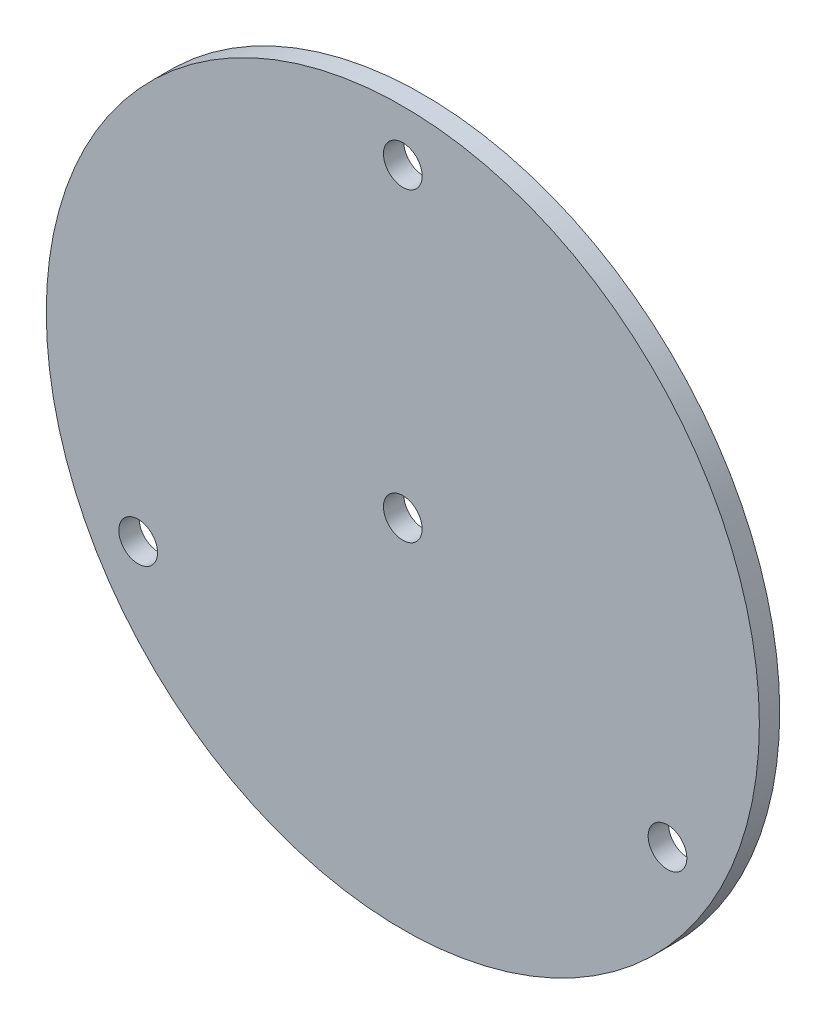
ISO-10303-21;
HEADER;
FILE_DESCRIPTION(('STEP AP214'),'2;1');
FILE_NAME('part.step','',(''),(''),'','','');
FILE_SCHEMA(('AUTOMOTIVE_DESIGN { 1 0 10303 214 1 1 1 1 }'));
ENDSEC;
DATA;
#1=APPLICATION_CONTEXT('core data for automotive mechanical design processes');
#2=APPLICATION_PROTOCOL_DEFINITION('international standard','automotive_design',2000,#1);
#3=PRODUCT_CONTEXT('',#1,'mechanical');
#4=PRODUCT('Part','Part','',(#3));
#5=PRODUCT_RELATED_PRODUCT_CATEGORY('part','',(#4));
#6=PRODUCT_DEFINITION_FORMATION('','',#4);
#7=PRODUCT_DEFINITION_CONTEXT('part definition',#1,'design');
#8=PRODUCT_DEFINITION('design','',#6,#7);
#9=PRODUCT_DEFINITION_SHAPE('','',#8);
#10=(LENGTH_UNIT() NAMED_UNIT(*) SI_UNIT(.MILLI.,.METRE.));
#11=(NAMED_UNIT(*) PLANE_ANGLE_UNIT() SI_UNIT($,.RADIAN.));
#12=(NAMED_UNIT(*) SI_UNIT($,.STERADIAN.) SOLID_ANGLE_UNIT());
#13=UNCERTAINTY_MEASURE_WITH_UNIT(LENGTH_MEASURE(1.E-05),#10,'distance_accuracy_value','');
#14=(GEOMETRIC_REPRESENTATION_CONTEXT(3) GLOBAL_UNCERTAINTY_ASSIGNED_CONTEXT((#13)) GLOBAL_UNIT_ASSIGNED_CONTEXT((#10,
#11,#12)) REPRESENTATION_CONTEXT('',''));
#15=CARTESIAN_POINT('',(0.,0.,0.));
#16=DIRECTION('',(0.,0.,1.));
#17=DIRECTION('',(1.,0.,0.));
#18=AXIS2_PLACEMENT_3D('',#15,#16,#17);
#19=CARTESIAN_POINT('',(0.,0.,2.));
#20=DIRECTION('',(0.,0.,-1.));
#21=DIRECTION('',(-1.,0.,0.));
#22=AXIS2_PLACEMENT_3D('',#19,#20,#21);
#23=CYLINDRICAL_SURFACE('',#22,35.);
#24=CARTESIAN_POINT('',(0.,0.,2.));
#25=DIRECTION('',(0.,0.,1.));
#26=DIRECTION('',(1.,0.,0.));
#27=AXIS2_PLACEMENT_3D('',#24,#25,#26);
#28=CIRCLE('',#27,35.);
#29=CARTESIAN_POINT('',(35.,0.,2.));
#30=VERTEX_POINT('',#29);
#31=EDGE_CURVE('E10',#30,#30,#28,.T.);
#32=ORIENTED_EDGE('',*,*,#31,.F.);
#33=EDGE_LOOP('',(#32));
#34=FACE_BOUND('',#33,.T.);
#35=CARTESIAN_POINT('',(0.,0.,0.));
#36=DIRECTION('',(0.,0.,1.));
#37=DIRECTION('',(1.,0.,0.));
#38=AXIS2_PLACEMENT_3D('',#35,#36,#37);
#39=CIRCLE('',#38,35.);
#40=CARTESIAN_POINT('',(35.,0.,0.));
#41=VERTEX_POINT('',#40);
#42=EDGE_CURVE('E45',#41,#41,#39,.T.);
#43=ORIENTED_EDGE('',*,*,#42,.T.);
#44=EDGE_LOOP('',(#43));
#45=FACE_BOUND('',#44,.T.);
#46=ADVANCED_FACE('F38',(#34,#45),#23,.T.);
#47=CARTESIAN_POINT('',(0.,0.,2.));
#48=DIRECTION('',(0.,0.,1.));
#49=DIRECTION('',(1.,0.,0.));
#50=AXIS2_PLACEMENT_3D('',#47,#48,#49);
#51=PLANE('',#50);
#52=CARTESIAN_POINT('',(0.,30.,2.));
#53=DIRECTION('',(0.,0.,1.));
#54=DIRECTION('',(1.,0.,0.));
#55=AXIS2_PLACEMENT_3D('',#52,#53,#54);
#56=CIRCLE('',#55,1.9);
#57=CARTESIAN_POINT('',(1.9,30.,2.));
#58=VERTEX_POINT('',#57);
#59=EDGE_CURVE('E59',#58,#58,#56,.T.);
#60=ORIENTED_EDGE('',*,*,#59,.F.);
#61=EDGE_LOOP('',(#60));
#62=FACE_BOUND('',#61,.T.);
#63=CARTESIAN_POINT('',(0.,0.,2.));
#64=DIRECTION('',(0.,0.,1.));
#65=DIRECTION('',(1.,0.,0.));
#66=AXIS2_PLACEMENT_3D('',#63,#64,#65);
#67=CIRCLE('',#66,1.9);
#68=CARTESIAN_POINT('',(1.9,0.,2.));
#69=VERTEX_POINT('',#68);
#70=EDGE_CURVE('E115',#69,#69,#67,.T.);
#71=ORIENTED_EDGE('',*,*,#70,.F.);
#72=EDGE_LOOP('',(#71));
#73=FACE_BOUND('',#72,.T.);
#74=CARTESIAN_POINT('',(25.9807621135332,-15.,2.));
#75=DIRECTION('',(0.,0.,1.));
#76=DIRECTION('',(1.,0.,0.));
#77=AXIS2_PLACEMENT_3D('',#74,#75,#76);
#78=CIRCLE('',#77,1.9);
#79=CARTESIAN_POINT('',(27.8807621135332,-15.,2.));
#80=VERTEX_POINT('',#79);
#81=EDGE_CURVE('E108',#80,#80,#78,.T.);
#82=ORIENTED_EDGE('',*,*,#81,.F.);
#83=EDGE_LOOP('',(#82));
#84=FACE_BOUND('',#83,.T.);
#85=CARTESIAN_POINT('',(-25.9807621135332,-15.,2.));
#86=DIRECTION('',(0.,0.,1.));
#87=DIRECTION('',(1.,0.,0.));
#88=AXIS2_PLACEMENT_3D('',#85,#86,#87);
#89=CIRCLE('',#88,1.9);
#90=CARTESIAN_POINT('',(-24.0807621135332,-15.,2.));
#91=VERTEX_POINT('',#90);
#92=EDGE_CURVE('E52',#91,#91,#89,.T.);
#93=ORIENTED_EDGE('',*,*,#92,.F.);
#94=EDGE_LOOP('',(#93));
#95=FACE_BOUND('',#94,.T.);
#96=ORIENTED_EDGE('',*,*,#31,.T.);
#97=EDGE_LOOP('',(#96));
#98=FACE_BOUND('',#97,.T.);
#99=ADVANCED_FACE('F83',(#62,#73,#84,#95,#98),#51,.T.);
#100=CARTESIAN_POINT('',(0.,0.,0.));
#101=DIRECTION('',(0.,0.,1.));
#102=DIRECTION('',(1.,0.,0.));
#103=AXIS2_PLACEMENT_3D('',#100,#101,#102);
#104=PLANE('',#103);
#105=CARTESIAN_POINT('',(0.,30.,0.));
#106=DIRECTION('',(0.,0.,1.));
#107=DIRECTION('',(1.,0.,0.));
#108=AXIS2_PLACEMENT_3D('',#105,#106,#107);
#109=CIRCLE('',#108,1.9);
#110=CARTESIAN_POINT('',(1.9,30.,0.));
#111=VERTEX_POINT('',#110);
#112=EDGE_CURVE('E41',#111,#111,#109,.T.);
#113=ORIENTED_EDGE('',*,*,#112,.T.);
#114=EDGE_LOOP('',(#113));
#115=FACE_BOUND('',#114,.T.);
#116=CARTESIAN_POINT('',(0.,0.,0.));
#117=DIRECTION('',(0.,0.,1.));
#118=DIRECTION('',(1.,0.,0.));
#119=AXIS2_PLACEMENT_3D('',#116,#117,#118);
#120=CIRCLE('',#119,1.9);
#121=CARTESIAN_POINT('',(1.9,0.,0.));
#122=VERTEX_POINT('',#121);
#123=EDGE_CURVE('E61',#122,#122,#120,.T.);
#124=ORIENTED_EDGE('',*,*,#123,.T.);
#125=EDGE_LOOP('',(#124));
#126=FACE_BOUND('',#125,.T.);
#127=CARTESIAN_POINT('',(25.9807621135332,-15.,0.));
#128=DIRECTION('',(0.,0.,1.));
#129=DIRECTION('',(1.,0.,0.));
#130=AXIS2_PLACEMENT_3D('',#127,#128,#129);
#131=CIRCLE('',#130,1.9);
#132=CARTESIAN_POINT('',(27.8807621135332,-15.,0.));
#133=VERTEX_POINT('',#132);
#134=EDGE_CURVE('E58',#133,#133,#131,.T.);
#135=ORIENTED_EDGE('',*,*,#134,.T.);
#136=EDGE_LOOP('',(#135));
#137=FACE_BOUND('',#136,.T.);
#138=CARTESIAN_POINT('',(-25.9807621135332,-15.,0.));
#139=DIRECTION('',(0.,0.,1.));
#140=DIRECTION('',(1.,0.,0.));
#141=AXIS2_PLACEMENT_3D('',#138,#139,#140);
#142=CIRCLE('',#141,1.9);
#143=CARTESIAN_POINT('',(-24.0807621135332,-15.,0.));
#144=VERTEX_POINT('',#143);
#145=EDGE_CURVE('E55',#144,#144,#142,.T.);
#146=ORIENTED_EDGE('',*,*,#145,.T.);
#147=EDGE_LOOP('',(#146));
#148=FACE_BOUND('',#147,.T.);
#149=ORIENTED_EDGE('',*,*,#42,.F.);
#150=EDGE_LOOP('',(#149));
#151=FACE_BOUND('',#150,.T.);
#152=ADVANCED_FACE('F68',(#115,#126,#137,#148,#151),#104,.F.);
#153=CARTESIAN_POINT('',(-25.9807621135332,-15.,-1.2E-05));
#154=DIRECTION('',(0.,0.,1.));
#155=DIRECTION('',(1.,0.,0.));
#156=AXIS2_PLACEMENT_3D('',#153,#154,#155);
#157=CYLINDRICAL_SURFACE('',#156,1.9);
#158=CARTESIAN_POINT('',(-24.0807621135332,-15.,2.));
#159=CARTESIAN_POINT('',(-24.0807621135332,-15.,1.97916666666667));
#160=CARTESIAN_POINT('',(-24.0807621135332,-15.,1.95833333333333));
#161=CARTESIAN_POINT('',(-24.0807621135332,-15.,1.91666666666667));
#162=CARTESIAN_POINT('',(-24.0807621135332,-15.,1.89583333333333));
#163=CARTESIAN_POINT('',(-24.0807621135332,-15.,1.85416666666667));
#164=CARTESIAN_POINT('',(-24.0807621135332,-15.,1.83333333333333));
#165=CARTESIAN_POINT('',(-24.0807621135332,-15.,1.79166666666667));
#166=CARTESIAN_POINT('',(-24.0807621135332,-15.,1.77083333333333));
#167=CARTESIAN_POINT('',(-24.0807621135332,-15.,1.72916666666667));
#168=CARTESIAN_POINT('',(-24.0807621135332,-15.,1.70833333333333));
#169=CARTESIAN_POINT('',(-24.0807621135332,-15.,1.66666666666667));
#170=CARTESIAN_POINT('',(-24.0807621135332,-15.,1.64583333333333));
#171=CARTESIAN_POINT('',(-24.0807621135332,-15.,1.60416666666667));
#172=CARTESIAN_POINT('',(-24.0807621135332,-15.,1.58333333333333));
#173=CARTESIAN_POINT('',(-24.0807621135332,-15.,1.54166666666667));
#174=CARTESIAN_POINT('',(-24.0807621135332,-15.,1.52083333333333));
#175=CARTESIAN_POINT('',(-24.0807621135332,-15.,1.47916666666667));
#176=CARTESIAN_POINT('',(-24.0807621135332,-15.,1.45833333333333));
#177=CARTESIAN_POINT('',(-24.0807621135332,-15.,1.41666666666667));
#178=CARTESIAN_POINT('',(-24.0807621135332,-15.,1.39583333333333));
#179=CARTESIAN_POINT('',(-24.0807621135332,-15.,1.35416666666667));
#180=CARTESIAN_POINT('',(-24.0807621135332,-15.,1.33333333333333));
#181=CARTESIAN_POINT('',(-24.0807621135332,-15.,1.29166666666667));
#182=CARTESIAN_POINT('',(-24.0807621135332,-15.,1.27083333333333));
#183=CARTESIAN_POINT('',(-24.0807621135332,-15.,1.22916666666667));
#184=CARTESIAN_POINT('',(-24.0807621135332,-15.,1.20833333333333));
#185=CARTESIAN_POINT('',(-24.0807621135332,-15.,1.16666666666667));
#186=CARTESIAN_POINT('',(-24.0807621135332,-15.,1.14583333333333));
#187=CARTESIAN_POINT('',(-24.0807621135332,-15.,1.10416666666667));
#188=CARTESIAN_POINT('',(-24.0807621135332,-15.,1.08333333333333));
#189=CARTESIAN_POINT('',(-24.0807621135332,-15.,1.04166666666667));
#190=CARTESIAN_POINT('',(-24.0807621135332,-15.,1.02083333333333));
#191=CARTESIAN_POINT('',(-24.0807621135332,-15.,0.979166666666667));
#192=CARTESIAN_POINT('',(-24.0807621135332,-15.,0.958333333333334));
#193=CARTESIAN_POINT('',(-24.0807621135332,-15.,0.916666666666667));
#194=CARTESIAN_POINT('',(-24.0807621135332,-15.,0.895833333333334));
#195=CARTESIAN_POINT('',(-24.0807621135332,-15.,0.854166666666667));
#196=CARTESIAN_POINT('',(-24.0807621135332,-15.,0.833333333333334));
#197=CARTESIAN_POINT('',(-24.0807621135332,-15.,0.791666666666667));
#198=CARTESIAN_POINT('',(-24.0807621135332,-15.,0.770833333333334));
#199=CARTESIAN_POINT('',(-24.0807621135332,-15.,0.729166666666667));
#200=CARTESIAN_POINT('',(-24.0807621135332,-15.,0.708333333333334));
#201=CARTESIAN_POINT('',(-24.0807621135332,-15.,0.666666666666667));
#202=CARTESIAN_POINT('',(-24.0807621135332,-15.,0.645833333333334));
#203=CARTESIAN_POINT('',(-24.0807621135332,-15.,0.604166666666667));
#204=CARTESIAN_POINT('',(-24.0807621135332,-15.,0.583333333333333));
#205=CARTESIAN_POINT('',(-24.0807621135332,-15.,0.541666666666667));
#206=CARTESIAN_POINT('',(-24.0807621135332,-15.,0.520833333333333));
#207=CARTESIAN_POINT('',(-24.0807621135332,-15.,0.479166666666667));
#208=CARTESIAN_POINT('',(-24.0807621135332,-15.,0.458333333333334));
#209=CARTESIAN_POINT('',(-24.0807621135332,-15.,0.416666666666667));
#210=CARTESIAN_POINT('',(-24.0807621135332,-15.,0.395833333333334));
#211=CARTESIAN_POINT('',(-24.0807621135332,-15.,0.354166666666667));
#212=CARTESIAN_POINT('',(-24.0807621135332,-15.,0.333333333333334));
#213=CARTESIAN_POINT('',(-24.0807621135332,-15.,0.291666666666667));
#214=CARTESIAN_POINT('',(-24.0807621135332,-15.,0.270833333333333));
#215=CARTESIAN_POINT('',(-24.0807621135332,-15.,0.229166666666667));
#216=CARTESIAN_POINT('',(-24.0807621135332,-15.,0.208333333333333));
#217=CARTESIAN_POINT('',(-24.0807621135332,-15.,0.166666666666667));
#218=CARTESIAN_POINT('',(-24.0807621135332,-15.,0.145833333333334));
#219=CARTESIAN_POINT('',(-24.0807621135332,-15.,0.104166666666667));
#220=CARTESIAN_POINT('',(-24.0807621135332,-15.,0.0833333333333336));
#221=CARTESIAN_POINT('',(-24.0807621135332,-15.,0.0416666666666669));
#222=CARTESIAN_POINT('',(-24.0807621135332,-15.,0.0208333333333335));
#223=CARTESIAN_POINT('',(-24.0807621135332,-15.,0.));
#224=B_SPLINE_CURVE_WITH_KNOTS('',3,(#158,#159,#160,#161,#162,#163,#164,#165,#166,#167,#168,
#169,#170,#171,#172,#173,#174,#175,#176,#177,#178,#179,#180,#181,#182,#183,#184,#185,#186,#187,
#188,#189,#190,#191,#192,#193,#194,#195,#196,#197,#198,#199,#200,#201,#202,#203,#204,#205,#206,
#207,#208,#209,#210,#211,#212,#213,#214,#215,#216,#217,#218,#219,#220,#221,#222,#223),
.UNSPECIFIED.,.F.,.F.,(4,2,2,2,2,2,2,2,2,2,2,2,2,2,2,2,2,2,2,2,2,2,2,2,2,2,2,2,2,2,2,2,4),(0.,
0.0624999999999996,0.125,0.1875,0.25,0.3125,0.375,0.4375,0.5,0.5625,0.625,0.6875,0.75,0.8125,
0.875,0.9375,1.,1.0625,1.125,1.1875,1.25,1.3125,1.375,1.4375,1.5,1.5625,1.625,1.6875,1.75,
1.8125,1.875,1.9375,2.),.UNSPECIFIED.);
#225=EDGE_CURVE('BSEAM94',#91,#144,#224,.T.);
#226=ORIENTED_EDGE('',*,*,#92,.T.);
#227=ORIENTED_EDGE('',*,*,#145,.F.);
#228=ORIENTED_EDGE('',*,*,#225,.T.);
#229=ORIENTED_EDGE('',*,*,#225,.F.);
#230=EDGE_LOOP('',(#226,#228,#227,#229));
#231=FACE_BOUND('',#230,.T.);
#232=ADVANCED_FACE('F94',(#231),#157,.F.);
#233=CARTESIAN_POINT('',(25.9807621135332,-15.,-1.2E-05));
#234=DIRECTION('',(0.,0.,1.));
#235=DIRECTION('',(1.,0.,0.));
#236=AXIS2_PLACEMENT_3D('',#233,#234,#235);
#237=CYLINDRICAL_SURFACE('',#236,1.9);
#238=CARTESIAN_POINT('',(27.8807621135332,-15.,2.));
#239=CARTESIAN_POINT('',(27.8807621135332,-15.,1.97916666666667));
#240=CARTESIAN_POINT('',(27.8807621135332,-15.,1.95833333333333));
#241=CARTESIAN_POINT('',(27.8807621135332,-15.,1.91666666666667));
#242=CARTESIAN_POINT('',(27.8807621135332,-15.,1.89583333333333));
#243=CARTESIAN_POINT('',(27.8807621135332,-15.,1.85416666666667));
#244=CARTESIAN_POINT('',(27.8807621135332,-15.,1.83333333333333));
#245=CARTESIAN_POINT('',(27.8807621135332,-15.,1.79166666666667));
#246=CARTESIAN_POINT('',(27.8807621135332,-15.,1.77083333333333));
#247=CARTESIAN_POINT('',(27.8807621135332,-15.,1.72916666666667));
#248=CARTESIAN_POINT('',(27.8807621135332,-15.,1.70833333333333));
#249=CARTESIAN_POINT('',(27.8807621135332,-15.,1.66666666666667));
#250=CARTESIAN_POINT('',(27.8807621135332,-15.,1.64583333333333));
#251=CARTESIAN_POINT('',(27.8807621135332,-15.,1.60416666666667));
#252=CARTESIAN_POINT('',(27.8807621135332,-15.,1.58333333333333));
#253=CARTESIAN_POINT('',(27.8807621135332,-15.,1.54166666666667));
#254=CARTESIAN_POINT('',(27.8807621135332,-15.,1.52083333333333));
#255=CARTESIAN_POINT('',(27.8807621135332,-15.,1.47916666666667));
#256=CARTESIAN_POINT('',(27.8807621135332,-15.,1.45833333333333));
#257=CARTESIAN_POINT('',(27.8807621135332,-15.,1.41666666666667));
#258=CARTESIAN_POINT('',(27.8807621135332,-15.,1.39583333333333));
#259=CARTESIAN_POINT('',(27.8807621135332,-15.,1.35416666666667));
#260=CARTESIAN_POINT('',(27.8807621135332,-15.,1.33333333333333));
#261=CARTESIAN_POINT('',(27.8807621135332,-15.,1.29166666666667));
#262=CARTESIAN_POINT('',(27.8807621135332,-15.,1.27083333333333));
#263=CARTESIAN_POINT('',(27.8807621135332,-15.,1.22916666666667));
#264=CARTESIAN_POINT('',(27.8807621135332,-15.,1.20833333333333));
#265=CARTESIAN_POINT('',(27.8807621135332,-15.,1.16666666666667));
#266=CARTESIAN_POINT('',(27.8807621135332,-15.,1.14583333333333));
#267=CARTESIAN_POINT('',(27.8807621135332,-15.,1.10416666666667));
#268=CARTESIAN_POINT('',(27.8807621135332,-15.,1.08333333333333));
#269=CARTESIAN_POINT('',(27.8807621135332,-15.,1.04166666666667));
#270=CARTESIAN_POINT('',(27.8807621135332,-15.,1.02083333333333));
#271=CARTESIAN_POINT('',(27.8807621135332,-15.,0.979166666666667));
#272=CARTESIAN_POINT('',(27.8807621135332,-15.,0.958333333333334));
#273=CARTESIAN_POINT('',(27.8807621135332,-15.,0.916666666666667));
#274=CARTESIAN_POINT('',(27.8807621135332,-15.,0.895833333333334));
#275=CARTESIAN_POINT('',(27.8807621135332,-15.,0.854166666666667));
#276=CARTESIAN_POINT('',(27.8807621135332,-15.,0.833333333333334));
#277=CARTESIAN_POINT('',(27.8807621135332,-15.,0.791666666666667));
#278=CARTESIAN_POINT('',(27.8807621135332,-15.,0.770833333333334));
#279=CARTESIAN_POINT('',(27.8807621135332,-15.,0.729166666666667));
#280=CARTESIAN_POINT('',(27.8807621135332,-15.,0.708333333333334));
#281=CARTESIAN_POINT('',(27.8807621135332,-15.,0.666666666666667));
#282=CARTESIAN_POINT('',(27.8807621135332,-15.,0.645833333333334));
#283=CARTESIAN_POINT('',(27.8807621135332,-15.,0.604166666666667));
#284=CARTESIAN_POINT('',(27.8807621135332,-15.,0.583333333333333));
#285=CARTESIAN_POINT('',(27.8807621135332,-15.,0.541666666666667));
#286=CARTESIAN_POINT('',(27.8807621135332,-15.,0.520833333333333));
#287=CARTESIAN_POINT('',(27.8807621135332,-15.,0.479166666666667));
#288=CARTESIAN_POINT('',(27.8807621135332,-15.,0.458333333333334));
#289=CARTESIAN_POINT('',(27.8807621135332,-15.,0.416666666666667));
#290=CARTESIAN_POINT('',(27.8807621135332,-15.,0.395833333333334));
#291=CARTESIAN_POINT('',(27.8807621135332,-15.,0.354166666666667));
#292=CARTESIAN_POINT('',(27.8807621135332,-15.,0.333333333333334));
#293=CARTESIAN_POINT('',(27.8807621135332,-15.,0.291666666666667));
#294=CARTESIAN_POINT('',(27.8807621135332,-15.,0.270833333333333));
#295=CARTESIAN_POINT('',(27.8807621135332,-15.,0.229166666666667));
#296=CARTESIAN_POINT('',(27.8807621135332,-15.,0.208333333333333));
#297=CARTESIAN_POINT('',(27.8807621135332,-15.,0.166666666666667));
#298=CARTESIAN_POINT('',(27.8807621135332,-15.,0.145833333333334));
#299=CARTESIAN_POINT('',(27.8807621135332,-15.,0.104166666666667));
#300=CARTESIAN_POINT('',(27.8807621135332,-15.,0.0833333333333336));
#301=CARTESIAN_POINT('',(27.8807621135332,-15.,0.0416666666666669));
#302=CARTESIAN_POINT('',(27.8807621135332,-15.,0.0208333333333335));
#303=CARTESIAN_POINT('',(27.8807621135332,-15.,0.));
#304=B_SPLINE_CURVE_WITH_KNOTS('',3,(#238,#239,#240,#241,#242,#243,#244,#245,#246,#247,#248,
#249,#250,#251,#252,#253,#254,#255,#256,#257,#258,#259,#260,#261,#262,#263,#264,#265,#266,#267,
#268,#269,#270,#271,#272,#273,#274,#275,#276,#277,#278,#279,#280,#281,#282,#283,#284,#285,#286,
#287,#288,#289,#290,#291,#292,#293,#294,#295,#296,#297,#298,#299,#300,#301,#302,#303),
.UNSPECIFIED.,.F.,.F.,(4,2,2,2,2,2,2,2,2,2,2,2,2,2,2,2,2,2,2,2,2,2,2,2,2,2,2,2,2,2,2,2,4),(0.,
0.0624999999999996,0.125,0.1875,0.25,0.3125,0.375,0.4375,0.5,0.5625,0.625,0.6875,0.75,0.8125,
0.875,0.9375,1.,1.0625,1.125,1.1875,1.25,1.3125,1.375,1.4375,1.5,1.5625,1.625,1.6875,1.75,
1.8125,1.875,1.9375,2.),.UNSPECIFIED.);
#305=EDGE_CURVE('BSEAM78',#80,#133,#304,.T.);
#306=ORIENTED_EDGE('',*,*,#81,.T.);
#307=ORIENTED_EDGE('',*,*,#134,.F.);
#308=ORIENTED_EDGE('',*,*,#305,.T.);
#309=ORIENTED_EDGE('',*,*,#305,.F.);
#310=EDGE_LOOP('',(#306,#308,#307,#309));
#311=FACE_BOUND('',#310,.T.);
#312=ADVANCED_FACE('F78',(#311),#237,.F.);
#313=CARTESIAN_POINT('',(0.,0.,-1.2E-05));
#314=DIRECTION('',(0.,0.,1.));
#315=DIRECTION('',(1.,0.,0.));
#316=AXIS2_PLACEMENT_3D('',#313,#314,#315);
#317=CYLINDRICAL_SURFACE('',#316,1.9);
#318=CARTESIAN_POINT('',(1.9,0.,2.));
#319=CARTESIAN_POINT('',(1.9,0.,1.97916666666667));
#320=CARTESIAN_POINT('',(1.9,0.,1.95833333333333));
#321=CARTESIAN_POINT('',(1.9,0.,1.91666666666667));
#322=CARTESIAN_POINT('',(1.9,0.,1.89583333333333));
#323=CARTESIAN_POINT('',(1.9,0.,1.85416666666667));
#324=CARTESIAN_POINT('',(1.9,0.,1.83333333333333));
#325=CARTESIAN_POINT('',(1.9,0.,1.79166666666667));
#326=CARTESIAN_POINT('',(1.9,0.,1.77083333333333));
#327=CARTESIAN_POINT('',(1.9,0.,1.72916666666667));
#328=CARTESIAN_POINT('',(1.9,0.,1.70833333333333));
#329=CARTESIAN_POINT('',(1.9,0.,1.66666666666667));
#330=CARTESIAN_POINT('',(1.9,0.,1.64583333333333));
#331=CARTESIAN_POINT('',(1.9,0.,1.60416666666667));
#332=CARTESIAN_POINT('',(1.9,0.,1.58333333333333));
#333=CARTESIAN_POINT('',(1.9,0.,1.54166666666667));
#334=CARTESIAN_POINT('',(1.9,0.,1.52083333333333));
#335=CARTESIAN_POINT('',(1.9,0.,1.47916666666667));
#336=CARTESIAN_POINT('',(1.9,0.,1.45833333333333));
#337=CARTESIAN_POINT('',(1.9,0.,1.41666666666667));
#338=CARTESIAN_POINT('',(1.9,0.,1.39583333333333));
#339=CARTESIAN_POINT('',(1.9,0.,1.35416666666667));
#340=CARTESIAN_POINT('',(1.9,0.,1.33333333333333));
#341=CARTESIAN_POINT('',(1.9,0.,1.29166666666667));
#342=CARTESIAN_POINT('',(1.9,0.,1.27083333333333));
#343=CARTESIAN_POINT('',(1.9,0.,1.22916666666667));
#344=CARTESIAN_POINT('',(1.9,0.,1.20833333333333));
#345=CARTESIAN_POINT('',(1.9,0.,1.16666666666667));
#346=CARTESIAN_POINT('',(1.9,0.,1.14583333333333));
#347=CARTESIAN_POINT('',(1.9,0.,1.10416666666667));
#348=CARTESIAN_POINT('',(1.9,0.,1.08333333333333));
#349=CARTESIAN_POINT('',(1.9,0.,1.04166666666667));
#350=CARTESIAN_POINT('',(1.9,0.,1.02083333333333));
#351=CARTESIAN_POINT('',(1.9,0.,0.979166666666667));
#352=CARTESIAN_POINT('',(1.9,0.,0.958333333333334));
#353=CARTESIAN_POINT('',(1.9,0.,0.916666666666667));
#354=CARTESIAN_POINT('',(1.9,0.,0.895833333333334));
#355=CARTESIAN_POINT('',(1.9,0.,0.854166666666667));
#356=CARTESIAN_POINT('',(1.9,0.,0.833333333333334));
#357=CARTESIAN_POINT('',(1.9,0.,0.791666666666667));
#358=CARTESIAN_POINT('',(1.9,0.,0.770833333333334));
#359=CARTESIAN_POINT('',(1.9,0.,0.729166666666667));
#360=CARTESIAN_POINT('',(1.9,0.,0.708333333333334));
#361=CARTESIAN_POINT('',(1.9,0.,0.666666666666667));
#362=CARTESIAN_POINT('',(1.9,0.,0.645833333333334));
#363=CARTESIAN_POINT('',(1.9,0.,0.604166666666667));
#364=CARTESIAN_POINT('',(1.9,0.,0.583333333333333));
#365=CARTESIAN_POINT('',(1.9,0.,0.541666666666667));
#366=CARTESIAN_POINT('',(1.9,0.,0.520833333333333));
#367=CARTESIAN_POINT('',(1.9,0.,0.479166666666667));
#368=CARTESIAN_POINT('',(1.9,0.,0.458333333333334));
#369=CARTESIAN_POINT('',(1.9,0.,0.416666666666667));
#370=CARTESIAN_POINT('',(1.9,0.,0.395833333333334));
#371=CARTESIAN_POINT('',(1.9,0.,0.354166666666667));
#372=CARTESIAN_POINT('',(1.9,0.,0.333333333333334));
#373=CARTESIAN_POINT('',(1.9,0.,0.291666666666667));
#374=CARTESIAN_POINT('',(1.9,0.,0.270833333333333));
#375=CARTESIAN_POINT('',(1.9,0.,0.229166666666667));
#376=CARTESIAN_POINT('',(1.9,0.,0.208333333333333));
#377=CARTESIAN_POINT('',(1.9,0.,0.166666666666667));
#378=CARTESIAN_POINT('',(1.9,0.,0.145833333333334));
#379=CARTESIAN_POINT('',(1.9,0.,0.104166666666667));
#380=CARTESIAN_POINT('',(1.9,0.,0.0833333333333336));
#381=CARTESIAN_POINT('',(1.9,0.,0.0416666666666669));
#382=CARTESIAN_POINT('',(1.9,0.,0.0208333333333335));
#383=CARTESIAN_POINT('',(1.9,0.,0.));
#384=B_SPLINE_CURVE_WITH_KNOTS('',3,(#318,#319,#320,#321,#322,#323,#324,#325,#326,#327,#328,
#329,#330,#331,#332,#333,#334,#335,#336,#337,#338,#339,#340,#341,#342,#343,#344,#345,#346,#347,
#348,#349,#350,#351,#352,#353,#354,#355,#356,#357,#358,#359,#360,#361,#362,#363,#364,#365,#366,
#367,#368,#369,#370,#371,#372,#373,#374,#375,#376,#377,#378,#379,#380,#381,#382,#383),
.UNSPECIFIED.,.F.,.F.,(4,2,2,2,2,2,2,2,2,2,2,2,2,2,2,2,2,2,2,2,2,2,2,2,2,2,2,2,2,2,2,2,4),(0.,
0.0624999999999996,0.125,0.1875,0.25,0.3125,0.375,0.4375,0.5,0.5625,0.625,0.6875,0.75,0.8125,
0.875,0.9375,1.,1.0625,1.125,1.1875,1.25,1.3125,1.375,1.4375,1.5,1.5625,1.625,1.6875,1.75,
1.8125,1.875,1.9375,2.),.UNSPECIFIED.);
#385=EDGE_CURVE('BSEAM72',#69,#122,#384,.T.);
#386=ORIENTED_EDGE('',*,*,#70,.T.);
#387=ORIENTED_EDGE('',*,*,#123,.F.);
#388=ORIENTED_EDGE('',*,*,#385,.T.);
#389=ORIENTED_EDGE('',*,*,#385,.F.);
#390=EDGE_LOOP('',(#386,#388,#387,#389));
#391=FACE_BOUND('',#390,.T.);
#392=ADVANCED_FACE('F72',(#391),#317,.F.);
#393=CARTESIAN_POINT('',(0.,30.,-1.2E-05));
#394=DIRECTION('',(0.,0.,1.));
#395=DIRECTION('',(1.,0.,0.));
#396=AXIS2_PLACEMENT_3D('',#393,#394,#395);
#397=CYLINDRICAL_SURFACE('',#396,1.9);
#398=CARTESIAN_POINT('',(1.9,30.,2.));
#399=CARTESIAN_POINT('',(1.9,30.,1.97916666666667));
#400=CARTESIAN_POINT('',(1.9,30.,1.95833333333333));
#401=CARTESIAN_POINT('',(1.9,30.,1.91666666666667));
#402=CARTESIAN_POINT('',(1.9,30.,1.89583333333333));
#403=CARTESIAN_POINT('',(1.9,30.,1.85416666666667));
#404=CARTESIAN_POINT('',(1.9,30.,1.83333333333333));
#405=CARTESIAN_POINT('',(1.9,30.,1.79166666666667));
#406=CARTESIAN_POINT('',(1.9,30.,1.77083333333333));
#407=CARTESIAN_POINT('',(1.9,30.,1.72916666666667));
#408=CARTESIAN_POINT('',(1.9,30.,1.70833333333333));
#409=CARTESIAN_POINT('',(1.9,30.,1.66666666666667));
#410=CARTESIAN_POINT('',(1.9,30.,1.64583333333333));
#411=CARTESIAN_POINT('',(1.9,30.,1.60416666666667));
#412=CARTESIAN_POINT('',(1.9,30.,1.58333333333333));
#413=CARTESIAN_POINT('',(1.9,30.,1.54166666666667));
#414=CARTESIAN_POINT('',(1.9,30.,1.52083333333333));
#415=CARTESIAN_POINT('',(1.9,30.,1.47916666666667));
#416=CARTESIAN_POINT('',(1.9,30.,1.45833333333333));
#417=CARTESIAN_POINT('',(1.9,30.,1.41666666666667));
#418=CARTESIAN_POINT('',(1.9,30.,1.39583333333333));
#419=CARTESIAN_POINT('',(1.9,30.,1.35416666666667));
#420=CARTESIAN_POINT('',(1.9,30.,1.33333333333333));
#421=CARTESIAN_POINT('',(1.9,30.,1.29166666666667));
#422=CARTESIAN_POINT('',(1.9,30.,1.27083333333333));
#423=CARTESIAN_POINT('',(1.9,30.,1.22916666666667));
#424=CARTESIAN_POINT('',(1.9,30.,1.20833333333333));
#425=CARTESIAN_POINT('',(1.9,30.,1.16666666666667));
#426=CARTESIAN_POINT('',(1.9,30.,1.14583333333333));
#427=CARTESIAN_POINT('',(1.9,30.,1.10416666666667));
#428=CARTESIAN_POINT('',(1.9,30.,1.08333333333333));
#429=CARTESIAN_POINT('',(1.9,30.,1.04166666666667));
#430=CARTESIAN_POINT('',(1.9,30.,1.02083333333333));
#431=CARTESIAN_POINT('',(1.9,30.,0.979166666666667));
#432=CARTESIAN_POINT('',(1.9,30.,0.958333333333334));
#433=CARTESIAN_POINT('',(1.9,30.,0.916666666666667));
#434=CARTESIAN_POINT('',(1.9,30.,0.895833333333334));
#435=CARTESIAN_POINT('',(1.9,30.,0.854166666666667));
#436=CARTESIAN_POINT('',(1.9,30.,0.833333333333334));
#437=CARTESIAN_POINT('',(1.9,30.,0.791666666666667));
#438=CARTESIAN_POINT('',(1.9,30.,0.770833333333334));
#439=CARTESIAN_POINT('',(1.9,30.,0.729166666666667));
#440=CARTESIAN_POINT('',(1.9,30.,0.708333333333334));
#441=CARTESIAN_POINT('',(1.9,30.,0.666666666666667));
#442=CARTESIAN_POINT('',(1.9,30.,0.645833333333334));
#443=CARTESIAN_POINT('',(1.9,30.,0.604166666666667));
#444=CARTESIAN_POINT('',(1.9,30.,0.583333333333333));
#445=CARTESIAN_POINT('',(1.9,30.,0.541666666666667));
#446=CARTESIAN_POINT('',(1.9,30.,0.520833333333333));
#447=CARTESIAN_POINT('',(1.9,30.,0.479166666666667));
#448=CARTESIAN_POINT('',(1.9,30.,0.458333333333334));
#449=CARTESIAN_POINT('',(1.9,30.,0.416666666666667));
#450=CARTESIAN_POINT('',(1.9,30.,0.395833333333334));
#451=CARTESIAN_POINT('',(1.9,30.,0.354166666666667));
#452=CARTESIAN_POINT('',(1.9,30.,0.333333333333334));
#453=CARTESIAN_POINT('',(1.9,30.,0.291666666666667));
#454=CARTESIAN_POINT('',(1.9,30.,0.270833333333333));
#455=CARTESIAN_POINT('',(1.9,30.,0.229166666666667));
#456=CARTESIAN_POINT('',(1.9,30.,0.208333333333333));
#457=CARTESIAN_POINT('',(1.9,30.,0.166666666666667));
#458=CARTESIAN_POINT('',(1.9,30.,0.145833333333334));
#459=CARTESIAN_POINT('',(1.9,30.,0.104166666666667));
#460=CARTESIAN_POINT('',(1.9,30.,0.0833333333333336));
#461=CARTESIAN_POINT('',(1.9,30.,0.0416666666666669));
#462=CARTESIAN_POINT('',(1.9,30.,0.0208333333333335));
#463=CARTESIAN_POINT('',(1.9,30.,0.));
#464=B_SPLINE_CURVE_WITH_KNOTS('',3,(#398,#399,#400,#401,#402,#403,#404,#405,#406,#407,#408,
#409,#410,#411,#412,#413,#414,#415,#416,#417,#418,#419,#420,#421,#422,#423,#424,#425,#426,#427,
#428,#429,#430,#431,#432,#433,#434,#435,#436,#437,#438,#439,#440,#441,#442,#443,#444,#445,#446,
#447,#448,#449,#450,#451,#452,#453,#454,#455,#456,#457,#458,#459,#460,#461,#462,#463),
.UNSPECIFIED.,.F.,.F.,(4,2,2,2,2,2,2,2,2,2,2,2,2,2,2,2,2,2,2,2,2,2,2,2,2,2,2,2,2,2,2,2,4),(0.,
0.0624999999999996,0.125,0.1875,0.25,0.3125,0.375,0.4375,0.5,0.5625,0.625,0.6875,0.75,0.8125,
0.875,0.9375,1.,1.0625,1.125,1.1875,1.25,1.3125,1.375,1.4375,1.5,1.5625,1.625,1.6875,1.75,
1.8125,1.875,1.9375,2.),.UNSPECIFIED.);
#465=EDGE_CURVE('BSEAM70',#58,#111,#464,.T.);
#466=ORIENTED_EDGE('',*,*,#59,.T.);
#467=ORIENTED_EDGE('',*,*,#112,.F.);
#468=ORIENTED_EDGE('',*,*,#465,.T.);
#469=ORIENTED_EDGE('',*,*,#465,.F.);
#470=EDGE_LOOP('',(#466,#468,#467,#469));
#471=FACE_BOUND('',#470,.T.);
#472=ADVANCED_FACE('F70',(#471),#397,.F.);
#473=CLOSED_SHELL('',(#46,#99,#152,#232,#312,#392,#472));
#474=MANIFOLD_SOLID_BREP('B2',#473);
#475=ADVANCED_BREP_SHAPE_REPRESENTATION('',(#18,#474),#14);
#476=SHAPE_DEFINITION_REPRESENTATION(#9,#475);
ENDSEC;
END-ISO-10303-21;
